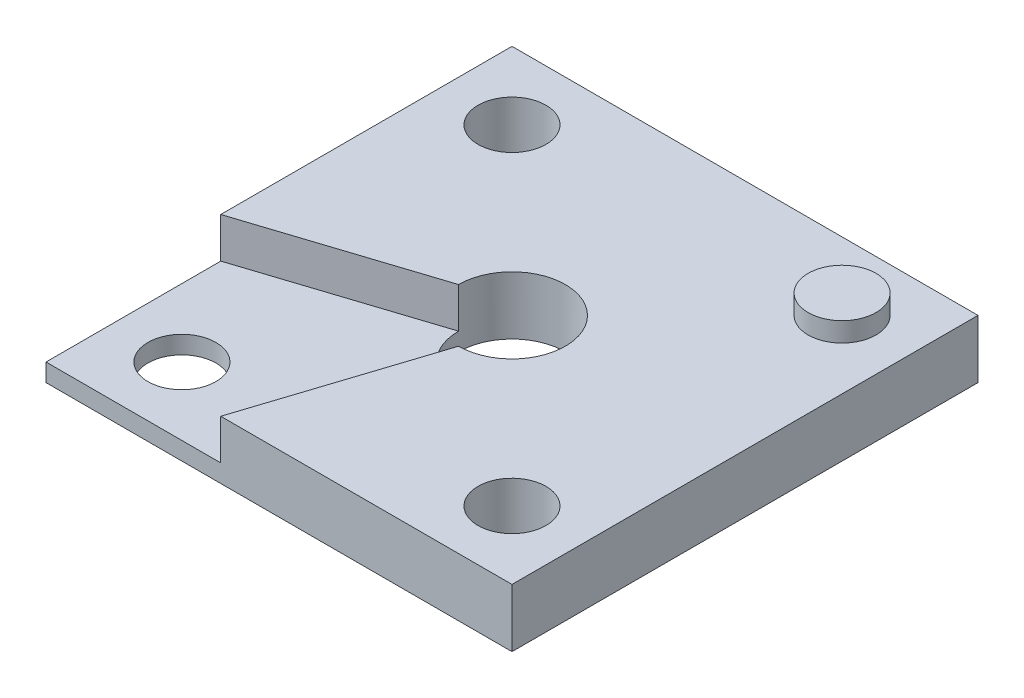
ISO-10303-21;
HEADER;
FILE_DESCRIPTION(('STEP AP214'),'2;1');
FILE_NAME('part.step','',(''),(''),'','','');
FILE_SCHEMA(('AUTOMOTIVE_DESIGN { 1 0 10303 214 1 1 1 1 }'));
ENDSEC;
DATA;
#1=APPLICATION_CONTEXT('core data for automotive mechanical design processes');
#2=APPLICATION_PROTOCOL_DEFINITION('international standard','automotive_design',2000,#1);
#3=PRODUCT_CONTEXT('',#1,'mechanical');
#4=PRODUCT('Part','Part','',(#3));
#5=PRODUCT_RELATED_PRODUCT_CATEGORY('part','',(#4));
#6=PRODUCT_DEFINITION_FORMATION('','',#4);
#7=PRODUCT_DEFINITION_CONTEXT('part definition',#1,'design');
#8=PRODUCT_DEFINITION('design','',#6,#7);
#9=PRODUCT_DEFINITION_SHAPE('','',#8);
#10=(LENGTH_UNIT() NAMED_UNIT(*) SI_UNIT(.MILLI.,.METRE.));
#11=(NAMED_UNIT(*) PLANE_ANGLE_UNIT() SI_UNIT($,.RADIAN.));
#12=(NAMED_UNIT(*) SI_UNIT($,.STERADIAN.) SOLID_ANGLE_UNIT());
#13=UNCERTAINTY_MEASURE_WITH_UNIT(LENGTH_MEASURE(1.E-05),#10,'distance_accuracy_value','');
#14=(GEOMETRIC_REPRESENTATION_CONTEXT(3) GLOBAL_UNCERTAINTY_ASSIGNED_CONTEXT((#13)) GLOBAL_UNIT_ASSIGNED_CONTEXT((#10,
#11,#12)) REPRESENTATION_CONTEXT('',''));
#15=CARTESIAN_POINT('',(0.,0.,0.));
#16=DIRECTION('',(0.,0.,1.));
#17=DIRECTION('',(1.,0.,0.));
#18=AXIS2_PLACEMENT_3D('',#15,#16,#17);
#19=CARTESIAN_POINT('',(-26.9875,9.525,26.9875));
#20=DIRECTION('',(0.,-1.,0.));
#21=DIRECTION('',(0.,0.,-1.));
#22=AXIS2_PLACEMENT_3D('',#19,#20,#21);
#23=CYLINDRICAL_SURFACE('',#22,5.55625);
#24=CARTESIAN_POINT('',(-26.9875,0.,26.9875));
#25=DIRECTION('',(0.,1.,0.));
#26=DIRECTION('',(0.,0.,1.));
#27=AXIS2_PLACEMENT_3D('',#24,#25,#26);
#28=CIRCLE('',#27,5.55625);
#29=CARTESIAN_POINT('',(-26.9875,0.,21.43125));
#30=VERTEX_POINT('',#29);
#31=EDGE_CURVE('E163',#30,#30,#28,.T.);
#32=CARTESIAN_POINT('',(-26.9875,2.921,26.9875));
#33=DIRECTION('',(0.,1.,0.));
#34=DIRECTION('',(0.,0.,1.));
#35=AXIS2_PLACEMENT_3D('',#32,#33,#34);
#36=CIRCLE('',#35,5.55625);
#37=CARTESIAN_POINT('',(-26.9875,2.921,21.43125));
#38=VERTEX_POINT('',#37);
#39=EDGE_CURVE('E171',#38,#38,#36,.T.);
#40=CARTESIAN_POINT('',(-26.9875,0.,21.43125));
#41=CARTESIAN_POINT('',(-26.9875,0.0304270833333334,21.43125));
#42=CARTESIAN_POINT('',(-26.9875,0.0608541666666668,21.43125));
#43=CARTESIAN_POINT('',(-26.9875,0.121708333333334,21.43125));
#44=CARTESIAN_POINT('',(-26.9875,0.152135416666667,21.43125));
#45=CARTESIAN_POINT('',(-26.9875,0.212989583333334,21.43125));
#46=CARTESIAN_POINT('',(-26.9875,0.243416666666667,21.43125));
#47=CARTESIAN_POINT('',(-26.9875,0.304270833333334,21.43125));
#48=CARTESIAN_POINT('',(-26.9875,0.334697916666667,21.43125));
#49=CARTESIAN_POINT('',(-26.9875,0.395552083333334,21.43125));
#50=CARTESIAN_POINT('',(-26.9875,0.425979166666668,21.43125));
#51=CARTESIAN_POINT('',(-26.9875,0.486833333333334,21.43125));
#52=CARTESIAN_POINT('',(-26.9875,0.517260416666667,21.43125));
#53=CARTESIAN_POINT('',(-26.9875,0.578114583333333,21.43125));
#54=CARTESIAN_POINT('',(-26.9875,0.608541666666666,21.43125));
#55=CARTESIAN_POINT('',(-26.9875,0.669395833333333,21.43125));
#56=CARTESIAN_POINT('',(-26.9875,0.699822916666667,21.43125));
#57=CARTESIAN_POINT('',(-26.9875,0.760677083333333,21.43125));
#58=CARTESIAN_POINT('',(-26.9875,0.791104166666667,21.43125));
#59=CARTESIAN_POINT('',(-26.9875,0.851958333333334,21.43125));
#60=CARTESIAN_POINT('',(-26.9875,0.882385416666667,21.43125));
#61=CARTESIAN_POINT('',(-26.9875,0.943239583333334,21.43125));
#62=CARTESIAN_POINT('',(-26.9875,0.973666666666667,21.43125));
#63=CARTESIAN_POINT('',(-26.9875,1.03452083333333,21.43125));
#64=CARTESIAN_POINT('',(-26.9875,1.06494791666667,21.43125));
#65=CARTESIAN_POINT('',(-26.9875,1.12580208333333,21.43125));
#66=CARTESIAN_POINT('',(-26.9875,1.15622916666667,21.43125));
#67=CARTESIAN_POINT('',(-26.9875,1.21708333333333,21.43125));
#68=CARTESIAN_POINT('',(-26.9875,1.24751041666667,21.43125));
#69=CARTESIAN_POINT('',(-26.9875,1.30836458333333,21.43125));
#70=CARTESIAN_POINT('',(-26.9875,1.33879166666667,21.43125));
#71=CARTESIAN_POINT('',(-26.9875,1.39964583333333,21.43125));
#72=CARTESIAN_POINT('',(-26.9875,1.43007291666667,21.43125));
#73=CARTESIAN_POINT('',(-26.9875,1.49092708333333,21.43125));
#74=CARTESIAN_POINT('',(-26.9875,1.52135416666667,21.43125));
#75=CARTESIAN_POINT('',(-26.9875,1.58220833333333,21.43125));
#76=CARTESIAN_POINT('',(-26.9875,1.61263541666667,21.43125));
#77=CARTESIAN_POINT('',(-26.9875,1.67348958333333,21.43125));
#78=CARTESIAN_POINT('',(-26.9875,1.70391666666667,21.43125));
#79=CARTESIAN_POINT('',(-26.9875,1.76477083333333,21.43125));
#80=CARTESIAN_POINT('',(-26.9875,1.79519791666667,21.43125));
#81=CARTESIAN_POINT('',(-26.9875,1.85605208333333,21.43125));
#82=CARTESIAN_POINT('',(-26.9875,1.88647916666667,21.43125));
#83=CARTESIAN_POINT('',(-26.9875,1.94733333333333,21.43125));
#84=CARTESIAN_POINT('',(-26.9875,1.97776041666667,21.43125));
#85=CARTESIAN_POINT('',(-26.9875,2.03861458333333,21.43125));
#86=CARTESIAN_POINT('',(-26.9875,2.06904166666667,21.43125));
#87=CARTESIAN_POINT('',(-26.9875,2.12989583333333,21.43125));
#88=CARTESIAN_POINT('',(-26.9875,2.16032291666667,21.43125));
#89=CARTESIAN_POINT('',(-26.9875,2.22117708333333,21.43125));
#90=CARTESIAN_POINT('',(-26.9875,2.25160416666667,21.43125));
#91=CARTESIAN_POINT('',(-26.9875,2.31245833333333,21.43125));
#92=CARTESIAN_POINT('',(-26.9875,2.34288541666667,21.43125));
#93=CARTESIAN_POINT('',(-26.9875,2.40373958333333,21.43125));
#94=CARTESIAN_POINT('',(-26.9875,2.43416666666667,21.43125));
#95=CARTESIAN_POINT('',(-26.9875,2.49502083333333,21.43125));
#96=CARTESIAN_POINT('',(-26.9875,2.52544791666667,21.43125));
#97=CARTESIAN_POINT('',(-26.9875,2.58630208333333,21.43125));
#98=CARTESIAN_POINT('',(-26.9875,2.61672916666667,21.43125));
#99=CARTESIAN_POINT('',(-26.9875,2.67758333333333,21.43125));
#100=CARTESIAN_POINT('',(-26.9875,2.70801041666667,21.43125));
#101=CARTESIAN_POINT('',(-26.9875,2.76886458333333,21.43125));
#102=CARTESIAN_POINT('',(-26.9875,2.79929166666667,21.43125));
#103=CARTESIAN_POINT('',(-26.9875,2.86014583333333,21.43125));
#104=CARTESIAN_POINT('',(-26.9875,2.89057291666667,21.43125));
#105=CARTESIAN_POINT('',(-26.9875,2.921,21.43125));
#106=B_SPLINE_CURVE_WITH_KNOTS('',3,(#40,#41,#42,#43,#44,#45,#46,#47,#48,#49,#50,#51,#52,#53,
#54,#55,#56,#57,#58,#59,#60,#61,#62,#63,#64,#65,#66,#67,#68,#69,#70,#71,#72,#73,#74,#75,#76,#77,
#78,#79,#80,#81,#82,#83,#84,#85,#86,#87,#88,#89,#90,#91,#92,#93,#94,#95,#96,#97,#98,#99,#100,
#101,#102,#103,#104,#105),.UNSPECIFIED.,.F.,.F.,(4,2,2,2,2,2,2,2,2,2,2,2,2,2,2,2,2,2,2,2,2,2,2,
2,2,2,2,2,2,2,2,2,4),(0.,0.0912812500000002,0.1825625,0.273843750000001,0.365125000000001,
0.456406250000001,0.5476875,0.63896875,0.73025,0.82153125,0.9128125,1.00409375,1.095375,
1.18665625,1.2779375,1.36921875,1.4605,1.55178125,1.6430625,1.73434375,1.825625,1.91690625,
2.0081875,2.09946875,2.19075,2.28203125,2.3733125,2.46459375,2.555875,2.64715625,2.7384375,
2.82971875,2.921),.UNSPECIFIED.);
#107=EDGE_CURVE('BSEAM39',#30,#38,#106,.T.);
#108=ORIENTED_EDGE('',*,*,#31,.F.);
#109=ORIENTED_EDGE('',*,*,#39,.T.);
#110=ORIENTED_EDGE('',*,*,#107,.T.);
#111=ORIENTED_EDGE('',*,*,#107,.F.);
#112=EDGE_LOOP('',(#108,#110,#109,#111));
#113=FACE_BOUND('',#112,.T.);
#114=ADVANCED_FACE('F39',(#113),#23,.F.);
#115=CARTESIAN_POINT('',(38.1,9.525,0.));
#116=DIRECTION('',(1.,0.,0.));
#117=DIRECTION('',(0.,0.,-1.));
#118=AXIS2_PLACEMENT_3D('',#115,#116,#117);
#119=PLANE('',#118);
#120=DIRECTION('',(0.,0.,1.));
#121=VECTOR('',#120,1.);
#122=CARTESIAN_POINT('',(38.1,0.,0.));
#123=LINE('',#122,#121);
#124=CARTESIAN_POINT('',(38.1,0.,-38.1));
#125=VERTEX_POINT('',#124);
#126=CARTESIAN_POINT('',(38.1,0.,38.1));
#127=VERTEX_POINT('',#126);
#128=EDGE_CURVE('E151',#125,#127,#123,.T.);
#129=ORIENTED_EDGE('',*,*,#128,.F.);
#130=DIRECTION('',(0.,-1.,0.));
#131=VECTOR('',#130,1.);
#132=CARTESIAN_POINT('',(38.1,9.525,-38.1));
#133=LINE('',#132,#131);
#134=CARTESIAN_POINT('',(38.1,9.525,-38.1));
#135=VERTEX_POINT('',#134);
#136=EDGE_CURVE('E11',#135,#125,#133,.T.);
#137=ORIENTED_EDGE('',*,*,#136,.F.);
#138=DIRECTION('',(0.,0.,1.));
#139=VECTOR('',#138,1.);
#140=CARTESIAN_POINT('',(38.1,9.525,0.));
#141=LINE('',#140,#139);
#142=CARTESIAN_POINT('',(38.1,9.525,38.1));
#143=VERTEX_POINT('',#142);
#144=EDGE_CURVE('E182',#135,#143,#141,.T.);
#145=ORIENTED_EDGE('',*,*,#144,.T.);
#146=DIRECTION('',(0.,-1.,0.));
#147=VECTOR('',#146,1.);
#148=CARTESIAN_POINT('',(38.1,9.525,38.1));
#149=LINE('',#148,#147);
#150=EDGE_CURVE('E83',#143,#127,#149,.T.);
#151=ORIENTED_EDGE('',*,*,#150,.T.);
#152=EDGE_LOOP('',(#129,#137,#145,#151));
#153=FACE_BOUND('',#152,.T.);
#154=ADVANCED_FACE('F249',(#153),#119,.T.);
#155=CARTESIAN_POINT('',(0.,9.525,-38.1));
#156=DIRECTION('',(0.,0.,-1.));
#157=DIRECTION('',(-1.,0.,0.));
#158=AXIS2_PLACEMENT_3D('',#155,#156,#157);
#159=PLANE('',#158);
#160=DIRECTION('',(1.,0.,0.));
#161=VECTOR('',#160,1.);
#162=CARTESIAN_POINT('',(0.,0.,-38.1));
#163=LINE('',#162,#161);
#164=CARTESIAN_POINT('',(-38.1,0.,-38.1));
#165=VERTEX_POINT('',#164);
#166=EDGE_CURVE('E147',#165,#125,#163,.T.);
#167=ORIENTED_EDGE('',*,*,#166,.F.);
#168=DIRECTION('',(0.,-1.,0.));
#169=VECTOR('',#168,1.);
#170=CARTESIAN_POINT('',(-38.1,9.525,-38.1));
#171=LINE('',#170,#169);
#172=CARTESIAN_POINT('',(-38.1,9.525,-38.1));
#173=VERTEX_POINT('',#172);
#174=EDGE_CURVE('E48',#173,#165,#171,.T.);
#175=ORIENTED_EDGE('',*,*,#174,.F.);
#176=DIRECTION('',(1.,0.,0.));
#177=VECTOR('',#176,1.);
#178=CARTESIAN_POINT('',(0.,9.525,-38.1));
#179=LINE('',#178,#177);
#180=EDGE_CURVE('E178',#173,#135,#179,.T.);
#181=ORIENTED_EDGE('',*,*,#180,.T.);
#182=ORIENTED_EDGE('',*,*,#136,.T.);
#183=EDGE_LOOP('',(#167,#175,#181,#182));
#184=FACE_BOUND('',#183,.T.);
#185=ADVANCED_FACE('F254',(#184),#159,.T.);
#186=CARTESIAN_POINT('',(-38.1,9.525,0.));
#187=DIRECTION('',(1.,0.,0.));
#188=DIRECTION('',(0.,0.,-1.));
#189=AXIS2_PLACEMENT_3D('',#186,#187,#188);
#190=PLANE('',#189);
#191=DIRECTION('',(0.,0.,1.));
#192=VECTOR('',#191,1.);
#193=CARTESIAN_POINT('',(-38.1,2.921,38.1));
#194=LINE('',#193,#192);
#195=CARTESIAN_POINT('',(-38.1,2.921,9.52499999999991));
#196=VERTEX_POINT('',#195);
#197=CARTESIAN_POINT('',(-38.1,2.921,38.1));
#198=VERTEX_POINT('',#197);
#199=EDGE_CURVE('E111',#196,#198,#194,.T.);
#200=ORIENTED_EDGE('',*,*,#199,.F.);
#201=DIRECTION('',(0.,1.,0.));
#202=VECTOR('',#201,1.);
#203=CARTESIAN_POINT('',(-38.1,2.921,9.52499999999991));
#204=LINE('',#203,#202);
#205=CARTESIAN_POINT('',(-38.1,9.525,9.52499999999991));
#206=VERTEX_POINT('',#205);
#207=EDGE_CURVE('E203',#196,#206,#204,.T.);
#208=ORIENTED_EDGE('',*,*,#207,.T.);
#209=DIRECTION('',(0.,0.,1.));
#210=VECTOR('',#209,1.);
#211=CARTESIAN_POINT('',(-38.1,9.525,0.));
#212=LINE('',#211,#210);
#213=EDGE_CURVE('E174',#173,#206,#212,.T.);
#214=ORIENTED_EDGE('',*,*,#213,.F.);
#215=ORIENTED_EDGE('',*,*,#174,.T.);
#216=DIRECTION('',(0.,0.,1.));
#217=VECTOR('',#216,1.);
#218=CARTESIAN_POINT('',(-38.1,0.,0.));
#219=LINE('',#218,#217);
#220=CARTESIAN_POINT('',(-38.1,0.,38.1));
#221=VERTEX_POINT('',#220);
#222=EDGE_CURVE('E134',#165,#221,#219,.T.);
#223=ORIENTED_EDGE('',*,*,#222,.T.);
#224=DIRECTION('',(0.,-1.,0.));
#225=VECTOR('',#224,1.);
#226=CARTESIAN_POINT('',(-38.1,9.525,38.1));
#227=LINE('',#226,#225);
#228=EDGE_CURVE('E126',#198,#221,#227,.T.);
#229=ORIENTED_EDGE('',*,*,#228,.F.);
#230=EDGE_LOOP('',(#200,#208,#214,#215,#223,#229));
#231=FACE_BOUND('',#230,.T.);
#232=ADVANCED_FACE('F132',(#231),#190,.F.);
#233=CARTESIAN_POINT('',(-26.9875,9.525,-26.9875));
#234=DIRECTION('',(0.,-1.,0.));
#235=DIRECTION('',(0.,0.,-1.));
#236=AXIS2_PLACEMENT_3D('',#233,#234,#235);
#237=CYLINDRICAL_SURFACE('',#236,5.55625);
#238=CARTESIAN_POINT('',(-26.9875,9.525,-26.9875));
#239=DIRECTION('',(0.,1.,0.));
#240=DIRECTION('',(0.,0.,1.));
#241=AXIS2_PLACEMENT_3D('',#238,#239,#240);
#242=CIRCLE('',#241,5.55625);
#243=CARTESIAN_POINT('',(-26.9875,9.525,-32.54375));
#244=VERTEX_POINT('',#243);
#245=EDGE_CURVE('E185',#244,#244,#242,.T.);
#246=CARTESIAN_POINT('',(-26.9875,0.,-26.9875));
#247=DIRECTION('',(0.,1.,0.));
#248=DIRECTION('',(0.,0.,1.));
#249=AXIS2_PLACEMENT_3D('',#246,#247,#248);
#250=CIRCLE('',#249,5.55625);
#251=CARTESIAN_POINT('',(-26.9875,0.,-32.54375));
#252=VERTEX_POINT('',#251);
#253=EDGE_CURVE('E155',#252,#252,#250,.T.);
#254=CARTESIAN_POINT('',(-26.9875,9.525,-32.54375));
#255=CARTESIAN_POINT('',(-26.9875,9.42578125,-32.54375));
#256=CARTESIAN_POINT('',(-26.9875,9.3265625,-32.54375));
#257=CARTESIAN_POINT('',(-26.9875,9.128125,-32.54375));
#258=CARTESIAN_POINT('',(-26.9875,9.02890625,-32.54375));
#259=CARTESIAN_POINT('',(-26.9875,8.83046875,-32.54375));
#260=CARTESIAN_POINT('',(-26.9875,8.73125,-32.54375));
#261=CARTESIAN_POINT('',(-26.9875,8.5328125,-32.54375));
#262=CARTESIAN_POINT('',(-26.9875,8.43359375,-32.54375));
#263=CARTESIAN_POINT('',(-26.9875,8.23515625,-32.54375));
#264=CARTESIAN_POINT('',(-26.9875,8.1359375,-32.54375));
#265=CARTESIAN_POINT('',(-26.9875,7.9375,-32.54375));
#266=CARTESIAN_POINT('',(-26.9875,7.83828125,-32.54375));
#267=CARTESIAN_POINT('',(-26.9875,7.63984375,-32.54375));
#268=CARTESIAN_POINT('',(-26.9875,7.540625,-32.54375));
#269=CARTESIAN_POINT('',(-26.9875,7.3421875,-32.54375));
#270=CARTESIAN_POINT('',(-26.9875,7.24296875,-32.54375));
#271=CARTESIAN_POINT('',(-26.9875,7.04453125,-32.54375));
#272=CARTESIAN_POINT('',(-26.9875,6.9453125,-32.54375));
#273=CARTESIAN_POINT('',(-26.9875,6.746875,-32.54375));
#274=CARTESIAN_POINT('',(-26.9875,6.64765625,-32.54375));
#275=CARTESIAN_POINT('',(-26.9875,6.44921875,-32.54375));
#276=CARTESIAN_POINT('',(-26.9875,6.35,-32.54375));
#277=CARTESIAN_POINT('',(-26.9875,6.1515625,-32.54375));
#278=CARTESIAN_POINT('',(-26.9875,6.05234375,-32.54375));
#279=CARTESIAN_POINT('',(-26.9875,5.85390625,-32.54375));
#280=CARTESIAN_POINT('',(-26.9875,5.7546875,-32.54375));
#281=CARTESIAN_POINT('',(-26.9875,5.55625,-32.54375));
#282=CARTESIAN_POINT('',(-26.9875,5.45703125,-32.54375));
#283=CARTESIAN_POINT('',(-26.9875,5.25859375,-32.54375));
#284=CARTESIAN_POINT('',(-26.9875,5.159375,-32.54375));
#285=CARTESIAN_POINT('',(-26.9875,4.9609375,-32.54375));
#286=CARTESIAN_POINT('',(-26.9875,4.86171875,-32.54375));
#287=CARTESIAN_POINT('',(-26.9875,4.66328125,-32.54375));
#288=CARTESIAN_POINT('',(-26.9875,4.5640625,-32.54375));
#289=CARTESIAN_POINT('',(-26.9875,4.365625,-32.54375));
#290=CARTESIAN_POINT('',(-26.9875,4.26640625,-32.54375));
#291=CARTESIAN_POINT('',(-26.9875,4.06796875,-32.54375));
#292=CARTESIAN_POINT('',(-26.9875,3.96875,-32.54375));
#293=CARTESIAN_POINT('',(-26.9875,3.7703125,-32.54375));
#294=CARTESIAN_POINT('',(-26.9875,3.67109375,-32.54375));
#295=CARTESIAN_POINT('',(-26.9875,3.47265625,-32.54375));
#296=CARTESIAN_POINT('',(-26.9875,3.3734375,-32.54375));
#297=CARTESIAN_POINT('',(-26.9875,3.175,-32.54375));
#298=CARTESIAN_POINT('',(-26.9875,3.07578125,-32.54375));
#299=CARTESIAN_POINT('',(-26.9875,2.87734375,-32.54375));
#300=CARTESIAN_POINT('',(-26.9875,2.778125,-32.54375));
#301=CARTESIAN_POINT('',(-26.9875,2.5796875,-32.54375));
#302=CARTESIAN_POINT('',(-26.9875,2.48046875,-32.54375));
#303=CARTESIAN_POINT('',(-26.9875,2.28203125,-32.54375));
#304=CARTESIAN_POINT('',(-26.9875,2.1828125,-32.54375));
#305=CARTESIAN_POINT('',(-26.9875,1.984375,-32.54375));
#306=CARTESIAN_POINT('',(-26.9875,1.88515625,-32.54375));
#307=CARTESIAN_POINT('',(-26.9875,1.68671875,-32.54375));
#308=CARTESIAN_POINT('',(-26.9875,1.5875,-32.54375));
#309=CARTESIAN_POINT('',(-26.9875,1.3890625,-32.54375));
#310=CARTESIAN_POINT('',(-26.9875,1.28984375,-32.54375));
#311=CARTESIAN_POINT('',(-26.9875,1.09140625,-32.54375));
#312=CARTESIAN_POINT('',(-26.9875,0.992187500000001,-32.54375));
#313=CARTESIAN_POINT('',(-26.9875,0.793750000000001,-32.54375));
#314=CARTESIAN_POINT('',(-26.9875,0.69453125,-32.54375));
#315=CARTESIAN_POINT('',(-26.9875,0.49609375,-32.54375));
#316=CARTESIAN_POINT('',(-26.9875,0.396875,-32.54375));
#317=CARTESIAN_POINT('',(-26.9875,0.1984375,-32.54375));
#318=CARTESIAN_POINT('',(-26.9875,0.0992187500000001,-32.54375));
#319=CARTESIAN_POINT('',(-26.9875,0.,-32.54375));
#320=B_SPLINE_CURVE_WITH_KNOTS('',3,(#254,#255,#256,#257,#258,#259,#260,#261,#262,#263,#264,
#265,#266,#267,#268,#269,#270,#271,#272,#273,#274,#275,#276,#277,#278,#279,#280,#281,#282,#283,
#284,#285,#286,#287,#288,#289,#290,#291,#292,#293,#294,#295,#296,#297,#298,#299,#300,#301,#302,
#303,#304,#305,#306,#307,#308,#309,#310,#311,#312,#313,#314,#315,#316,#317,#318,#319),
.UNSPECIFIED.,.F.,.F.,(4,2,2,2,2,2,2,2,2,2,2,2,2,2,2,2,2,2,2,2,2,2,2,2,2,2,2,2,2,2,2,2,4),(0.,
0.29765625,0.5953125,0.892968750000001,1.190625,1.48828125,1.7859375,2.08359375,2.38125,
2.67890625,2.9765625,3.27421875,3.571875,3.86953125,4.1671875,4.46484375,4.7625,5.06015625,
5.3578125,5.65546875,5.953125,6.25078125,6.5484375,6.84609375,7.14375,7.44140625,7.7390625,
8.03671875,8.334375,8.63203125,8.9296875,9.22734375,9.525),.UNSPECIFIED.);
#321=EDGE_CURVE('BSEAM262',#244,#252,#320,.T.);
#322=ORIENTED_EDGE('',*,*,#245,.T.);
#323=ORIENTED_EDGE('',*,*,#253,.F.);
#324=ORIENTED_EDGE('',*,*,#321,.T.);
#325=ORIENTED_EDGE('',*,*,#321,.F.);
#326=EDGE_LOOP('',(#322,#324,#323,#325));
#327=FACE_BOUND('',#326,.T.);
#328=ADVANCED_FACE('F262',(#327),#237,.F.);
#329=CARTESIAN_POINT('',(26.9875,9.525,26.9875));
#330=DIRECTION('',(0.,-1.,0.));
#331=DIRECTION('',(0.,0.,-1.));
#332=AXIS2_PLACEMENT_3D('',#329,#330,#331);
#333=CYLINDRICAL_SURFACE('',#332,5.55625);
#334=CARTESIAN_POINT('',(26.9875,9.525,26.9875));
#335=DIRECTION('',(0.,1.,0.));
#336=DIRECTION('',(0.,0.,1.));
#337=AXIS2_PLACEMENT_3D('',#334,#335,#336);
#338=CIRCLE('',#337,5.55625);
#339=CARTESIAN_POINT('',(26.9875,9.525,21.43125));
#340=VERTEX_POINT('',#339);
#341=EDGE_CURVE('E189',#340,#340,#338,.T.);
#342=CARTESIAN_POINT('',(26.9875,0.,26.9875));
#343=DIRECTION('',(0.,1.,0.));
#344=DIRECTION('',(0.,0.,1.));
#345=AXIS2_PLACEMENT_3D('',#342,#343,#344);
#346=CIRCLE('',#345,5.55625);
#347=CARTESIAN_POINT('',(26.9875,0.,21.43125));
#348=VERTEX_POINT('',#347);
#349=EDGE_CURVE('E159',#348,#348,#346,.T.);
#350=CARTESIAN_POINT('',(26.9875,9.525,21.43125));
#351=CARTESIAN_POINT('',(26.9875,9.42578125,21.43125));
#352=CARTESIAN_POINT('',(26.9875,9.3265625,21.43125));
#353=CARTESIAN_POINT('',(26.9875,9.128125,21.43125));
#354=CARTESIAN_POINT('',(26.9875,9.02890625,21.43125));
#355=CARTESIAN_POINT('',(26.9875,8.83046875,21.43125));
#356=CARTESIAN_POINT('',(26.9875,8.73125,21.43125));
#357=CARTESIAN_POINT('',(26.9875,8.5328125,21.43125));
#358=CARTESIAN_POINT('',(26.9875,8.43359375,21.43125));
#359=CARTESIAN_POINT('',(26.9875,8.23515625,21.43125));
#360=CARTESIAN_POINT('',(26.9875,8.1359375,21.43125));
#361=CARTESIAN_POINT('',(26.9875,7.9375,21.43125));
#362=CARTESIAN_POINT('',(26.9875,7.83828125,21.43125));
#363=CARTESIAN_POINT('',(26.9875,7.63984375,21.43125));
#364=CARTESIAN_POINT('',(26.9875,7.540625,21.43125));
#365=CARTESIAN_POINT('',(26.9875,7.3421875,21.43125));
#366=CARTESIAN_POINT('',(26.9875,7.24296875,21.43125));
#367=CARTESIAN_POINT('',(26.9875,7.04453125,21.43125));
#368=CARTESIAN_POINT('',(26.9875,6.9453125,21.43125));
#369=CARTESIAN_POINT('',(26.9875,6.746875,21.43125));
#370=CARTESIAN_POINT('',(26.9875,6.64765625,21.43125));
#371=CARTESIAN_POINT('',(26.9875,6.44921875,21.43125));
#372=CARTESIAN_POINT('',(26.9875,6.35,21.43125));
#373=CARTESIAN_POINT('',(26.9875,6.1515625,21.43125));
#374=CARTESIAN_POINT('',(26.9875,6.05234375,21.43125));
#375=CARTESIAN_POINT('',(26.9875,5.85390625,21.43125));
#376=CARTESIAN_POINT('',(26.9875,5.7546875,21.43125));
#377=CARTESIAN_POINT('',(26.9875,5.55625,21.43125));
#378=CARTESIAN_POINT('',(26.9875,5.45703125,21.43125));
#379=CARTESIAN_POINT('',(26.9875,5.25859375,21.43125));
#380=CARTESIAN_POINT('',(26.9875,5.159375,21.43125));
#381=CARTESIAN_POINT('',(26.9875,4.9609375,21.43125));
#382=CARTESIAN_POINT('',(26.9875,4.86171875,21.43125));
#383=CARTESIAN_POINT('',(26.9875,4.66328125,21.43125));
#384=CARTESIAN_POINT('',(26.9875,4.5640625,21.43125));
#385=CARTESIAN_POINT('',(26.9875,4.365625,21.43125));
#386=CARTESIAN_POINT('',(26.9875,4.26640625,21.43125));
#387=CARTESIAN_POINT('',(26.9875,4.06796875,21.43125));
#388=CARTESIAN_POINT('',(26.9875,3.96875,21.43125));
#389=CARTESIAN_POINT('',(26.9875,3.7703125,21.43125));
#390=CARTESIAN_POINT('',(26.9875,3.67109375,21.43125));
#391=CARTESIAN_POINT('',(26.9875,3.47265625,21.43125));
#392=CARTESIAN_POINT('',(26.9875,3.3734375,21.43125));
#393=CARTESIAN_POINT('',(26.9875,3.175,21.43125));
#394=CARTESIAN_POINT('',(26.9875,3.07578125,21.43125));
#395=CARTESIAN_POINT('',(26.9875,2.87734375,21.43125));
#396=CARTESIAN_POINT('',(26.9875,2.778125,21.43125));
#397=CARTESIAN_POINT('',(26.9875,2.5796875,21.43125));
#398=CARTESIAN_POINT('',(26.9875,2.48046875,21.43125));
#399=CARTESIAN_POINT('',(26.9875,2.28203125,21.43125));
#400=CARTESIAN_POINT('',(26.9875,2.1828125,21.43125));
#401=CARTESIAN_POINT('',(26.9875,1.984375,21.43125));
#402=CARTESIAN_POINT('',(26.9875,1.88515625,21.43125));
#403=CARTESIAN_POINT('',(26.9875,1.68671875,21.43125));
#404=CARTESIAN_POINT('',(26.9875,1.5875,21.43125));
#405=CARTESIAN_POINT('',(26.9875,1.3890625,21.43125));
#406=CARTESIAN_POINT('',(26.9875,1.28984375,21.43125));
#407=CARTESIAN_POINT('',(26.9875,1.09140625,21.43125));
#408=CARTESIAN_POINT('',(26.9875,0.992187500000001,21.43125));
#409=CARTESIAN_POINT('',(26.9875,0.793750000000001,21.43125));
#410=CARTESIAN_POINT('',(26.9875,0.69453125,21.43125));
#411=CARTESIAN_POINT('',(26.9875,0.49609375,21.43125));
#412=CARTESIAN_POINT('',(26.9875,0.396875,21.43125));
#413=CARTESIAN_POINT('',(26.9875,0.1984375,21.43125));
#414=CARTESIAN_POINT('',(26.9875,0.0992187500000001,21.43125));
#415=CARTESIAN_POINT('',(26.9875,0.,21.43125));
#416=B_SPLINE_CURVE_WITH_KNOTS('',3,(#350,#351,#352,#353,#354,#355,#356,#357,#358,#359,#360,
#361,#362,#363,#364,#365,#366,#367,#368,#369,#370,#371,#372,#373,#374,#375,#376,#377,#378,#379,
#380,#381,#382,#383,#384,#385,#386,#387,#388,#389,#390,#391,#392,#393,#394,#395,#396,#397,#398,
#399,#400,#401,#402,#403,#404,#405,#406,#407,#408,#409,#410,#411,#412,#413,#414,#415),
.UNSPECIFIED.,.F.,.F.,(4,2,2,2,2,2,2,2,2,2,2,2,2,2,2,2,2,2,2,2,2,2,2,2,2,2,2,2,2,2,2,2,4),(0.,
0.29765625,0.5953125,0.892968750000001,1.190625,1.48828125,1.7859375,2.08359375,2.38125,
2.67890625,2.9765625,3.27421875,3.571875,3.86953125,4.1671875,4.46484375,4.7625,5.06015625,
5.3578125,5.65546875,5.953125,6.25078125,6.5484375,6.84609375,7.14375,7.44140625,7.7390625,
8.03671875,8.334375,8.63203125,8.9296875,9.22734375,9.525),.UNSPECIFIED.);
#417=EDGE_CURVE('BSEAM259',#340,#348,#416,.T.);
#418=ORIENTED_EDGE('',*,*,#341,.T.);
#419=ORIENTED_EDGE('',*,*,#349,.F.);
#420=ORIENTED_EDGE('',*,*,#417,.T.);
#421=ORIENTED_EDGE('',*,*,#417,.F.);
#422=EDGE_LOOP('',(#418,#420,#419,#421));
#423=FACE_BOUND('',#422,.T.);
#424=ADVANCED_FACE('F259',(#423),#333,.F.);
#425=CARTESIAN_POINT('',(0.,9.525,0.));
#426=DIRECTION('',(0.,-1.,0.));
#427=DIRECTION('',(0.,0.,-1.));
#428=AXIS2_PLACEMENT_3D('',#425,#426,#427);
#429=CYLINDRICAL_SURFACE('',#428,8.73125);
#430=DIRECTION('',(0.,1.,0.));
#431=VECTOR('',#430,1.);
#432=CARTESIAN_POINT('',(-8.73125000000001,2.921,0.));
#433=LINE('',#432,#431);
#434=CARTESIAN_POINT('',(-8.73125000000001,2.921,0.));
#435=VERTEX_POINT('',#434);
#436=CARTESIAN_POINT('',(-8.73125000000001,9.525,0.));
#437=VERTEX_POINT('',#436);
#438=EDGE_CURVE('E210',#435,#437,#433,.T.);
#439=ORIENTED_EDGE('',*,*,#438,.F.);
#440=CARTESIAN_POINT('',(0.,2.921,0.));
#441=DIRECTION('',(0.,1.,0.));
#442=DIRECTION('',(0.,0.,1.));
#443=AXIS2_PLACEMENT_3D('',#440,#441,#442);
#444=CIRCLE('',#443,8.73125);
#445=CARTESIAN_POINT('',(0.,2.921,8.73124999999999));
#446=VERTEX_POINT('',#445);
#447=EDGE_CURVE('E199',#435,#446,#444,.T.);
#448=ORIENTED_EDGE('',*,*,#447,.T.);
#449=DIRECTION('',(0.,1.,0.));
#450=VECTOR('',#449,1.);
#451=CARTESIAN_POINT('',(0.,2.921,8.73124999999999));
#452=LINE('',#451,#450);
#453=CARTESIAN_POINT('',(0.,9.525,8.73124999999999));
#454=VERTEX_POINT('',#453);
#455=EDGE_CURVE('E206',#446,#454,#452,.T.);
#456=ORIENTED_EDGE('',*,*,#455,.T.);
#457=CARTESIAN_POINT('',(0.,9.525,0.));
#458=DIRECTION('',(0.,1.,0.));
#459=DIRECTION('',(0.,0.,1.));
#460=AXIS2_PLACEMENT_3D('',#457,#458,#459);
#461=CIRCLE('',#460,8.73125);
#462=EDGE_CURVE('E144',#454,#437,#461,.T.);
#463=ORIENTED_EDGE('',*,*,#462,.T.);
#464=EDGE_LOOP('',(#439,#448,#456,#463));
#465=FACE_BOUND('',#464,.T.);
#466=CARTESIAN_POINT('',(0.,0.,0.));
#467=DIRECTION('',(0.,1.,0.));
#468=DIRECTION('',(0.,0.,1.));
#469=AXIS2_PLACEMENT_3D('',#466,#467,#468);
#470=CIRCLE('',#469,8.73125);
#471=CARTESIAN_POINT('',(0.,0.,8.73125));
#472=VERTEX_POINT('',#471);
#473=EDGE_CURVE('E167',#472,#472,#470,.T.);
#474=ORIENTED_EDGE('',*,*,#473,.F.);
#475=EDGE_LOOP('',(#474));
#476=FACE_BOUND('',#475,.T.);
#477=ADVANCED_FACE('F41',(#465,#476),#429,.F.);
#478=CARTESIAN_POINT('',(0.,9.525,38.1));
#479=DIRECTION('',(0.,0.,-1.));
#480=DIRECTION('',(-1.,0.,0.));
#481=AXIS2_PLACEMENT_3D('',#478,#479,#480);
#482=PLANE('',#481);
#483=DIRECTION('',(1.,0.,0.));
#484=VECTOR('',#483,1.);
#485=CARTESIAN_POINT('',(0.,9.525,38.1));
#486=LINE('',#485,#484);
#487=CARTESIAN_POINT('',(-9.52500000000001,9.525,38.1));
#488=VERTEX_POINT('',#487);
#489=EDGE_CURVE('E63',#488,#143,#486,.T.);
#490=ORIENTED_EDGE('',*,*,#489,.F.);
#491=DIRECTION('',(0.,1.,0.));
#492=VECTOR('',#491,1.);
#493=CARTESIAN_POINT('',(-9.52500000000001,2.921,38.1));
#494=LINE('',#493,#492);
#495=CARTESIAN_POINT('',(-9.52500000000001,2.921,38.1));
#496=VERTEX_POINT('',#495);
#497=EDGE_CURVE('E55',#496,#488,#494,.T.);
#498=ORIENTED_EDGE('',*,*,#497,.F.);
#499=DIRECTION('',(1.,0.,0.));
#500=VECTOR('',#499,1.);
#501=CARTESIAN_POINT('',(-9.52500000000001,2.921,38.1));
#502=LINE('',#501,#500);
#503=EDGE_CURVE('E115',#198,#496,#502,.T.);
#504=ORIENTED_EDGE('',*,*,#503,.F.);
#505=ORIENTED_EDGE('',*,*,#228,.T.);
#506=DIRECTION('',(1.,0.,0.));
#507=VECTOR('',#506,1.);
#508=CARTESIAN_POINT('',(0.,0.,38.1));
#509=LINE('',#508,#507);
#510=EDGE_CURVE('E141',#221,#127,#509,.T.);
#511=ORIENTED_EDGE('',*,*,#510,.T.);
#512=ORIENTED_EDGE('',*,*,#150,.F.);
#513=EDGE_LOOP('',(#490,#498,#504,#505,#511,#512));
#514=FACE_BOUND('',#513,.T.);
#515=ADVANCED_FACE('F125',(#514),#482,.F.);
#516=CARTESIAN_POINT('',(0.,9.525,0.));
#517=DIRECTION('',(0.,1.,0.));
#518=DIRECTION('',(0.,0.,1.));
#519=AXIS2_PLACEMENT_3D('',#516,#517,#518);
#520=PLANE('',#519);
#521=CARTESIAN_POINT('',(26.9875,9.525,-26.9875));
#522=DIRECTION('',(0.,1.,0.));
#523=DIRECTION('',(0.,0.,1.));
#524=AXIS2_PLACEMENT_3D('',#521,#522,#523);
#525=CIRCLE('',#524,5.55625);
#526=CARTESIAN_POINT('',(26.9875,9.525,-21.43125));
#527=VERTEX_POINT('',#526);
#528=EDGE_CURVE('E220',#527,#527,#525,.F.);
#529=ORIENTED_EDGE('',*,*,#528,.T.);
#530=EDGE_LOOP('',(#529));
#531=FACE_BOUND('',#530,.T.);
#532=DIRECTION('',(-0.951222818948763,0.,0.308504698037434));
#533=VECTOR('',#532,1.);
#534=CARTESIAN_POINT('',(-38.1,9.525,9.52499999999991));
#535=LINE('',#534,#533);
#536=EDGE_CURVE('E122',#437,#206,#535,.T.);
#537=ORIENTED_EDGE('',*,*,#536,.F.);
#538=ORIENTED_EDGE('',*,*,#462,.F.);
#539=DIRECTION('',(0.308504698037436,0.,-0.951222818948763));
#540=VECTOR('',#539,1.);
#541=CARTESIAN_POINT('',(0.,9.525,8.73124999999999));
#542=LINE('',#541,#540);
#543=EDGE_CURVE('E217',#488,#454,#542,.T.);
#544=ORIENTED_EDGE('',*,*,#543,.F.);
#545=ORIENTED_EDGE('',*,*,#489,.T.);
#546=ORIENTED_EDGE('',*,*,#144,.F.);
#547=ORIENTED_EDGE('',*,*,#180,.F.);
#548=ORIENTED_EDGE('',*,*,#213,.T.);
#549=EDGE_LOOP('',(#537,#538,#544,#545,#546,#547,#548));
#550=FACE_BOUND('',#549,.T.);
#551=ORIENTED_EDGE('',*,*,#341,.F.);
#552=EDGE_LOOP('',(#551));
#553=FACE_BOUND('',#552,.T.);
#554=ORIENTED_EDGE('',*,*,#245,.F.);
#555=EDGE_LOOP('',(#554));
#556=FACE_BOUND('',#555,.T.);
#557=ADVANCED_FACE('F274',(#531,#550,#553,#556),#520,.T.);
#558=CARTESIAN_POINT('',(0.,0.,0.));
#559=DIRECTION('',(0.,1.,0.));
#560=DIRECTION('',(0.,0.,1.));
#561=AXIS2_PLACEMENT_3D('',#558,#559,#560);
#562=PLANE('',#561);
#563=ORIENTED_EDGE('',*,*,#473,.T.);
#564=EDGE_LOOP('',(#563));
#565=FACE_BOUND('',#564,.T.);
#566=ORIENTED_EDGE('',*,*,#31,.T.);
#567=EDGE_LOOP('',(#566));
#568=FACE_BOUND('',#567,.T.);
#569=ORIENTED_EDGE('',*,*,#349,.T.);
#570=EDGE_LOOP('',(#569));
#571=FACE_BOUND('',#570,.T.);
#572=ORIENTED_EDGE('',*,*,#253,.T.);
#573=EDGE_LOOP('',(#572));
#574=FACE_BOUND('',#573,.T.);
#575=ORIENTED_EDGE('',*,*,#128,.T.);
#576=ORIENTED_EDGE('',*,*,#510,.F.);
#577=ORIENTED_EDGE('',*,*,#222,.F.);
#578=ORIENTED_EDGE('',*,*,#166,.T.);
#579=EDGE_LOOP('',(#575,#576,#577,#578));
#580=FACE_BOUND('',#579,.T.);
#581=ADVANCED_FACE('F275',(#565,#568,#571,#574,#580),#562,.F.);
#582=CARTESIAN_POINT('',(-38.1,2.921,9.52499999999991));
#583=DIRECTION('',(-0.308504698037434,0.,-0.951222818948763));
#584=DIRECTION('',(-0.951222818948763,0.,0.308504698037434));
#585=AXIS2_PLACEMENT_3D('',#582,#583,#584);
#586=PLANE('',#585);
#587=ORIENTED_EDGE('',*,*,#536,.T.);
#588=ORIENTED_EDGE('',*,*,#207,.F.);
#589=DIRECTION('',(-0.951222818948763,0.,0.308504698037434));
#590=VECTOR('',#589,1.);
#591=CARTESIAN_POINT('',(-38.1,2.921,9.52499999999991));
#592=LINE('',#591,#590);
#593=EDGE_CURVE('E117',#435,#196,#592,.T.);
#594=ORIENTED_EDGE('',*,*,#593,.F.);
#595=ORIENTED_EDGE('',*,*,#438,.T.);
#596=EDGE_LOOP('',(#587,#588,#594,#595));
#597=FACE_BOUND('',#596,.T.);
#598=ADVANCED_FACE('F278',(#597),#586,.F.);
#599=CARTESIAN_POINT('',(0.,2.921,8.73124999999999));
#600=DIRECTION('',(0.951222818948763,0.,0.308504698037436));
#601=DIRECTION('',(0.308504698037436,0.,-0.951222818948763));
#602=AXIS2_PLACEMENT_3D('',#599,#600,#601);
#603=PLANE('',#602);
#604=ORIENTED_EDGE('',*,*,#543,.T.);
#605=ORIENTED_EDGE('',*,*,#455,.F.);
#606=DIRECTION('',(0.308504698037436,0.,-0.951222818948763));
#607=VECTOR('',#606,1.);
#608=CARTESIAN_POINT('',(0.,2.921,8.73124999999999));
#609=LINE('',#608,#607);
#610=EDGE_CURVE('E129',#496,#446,#609,.T.);
#611=ORIENTED_EDGE('',*,*,#610,.F.);
#612=ORIENTED_EDGE('',*,*,#497,.T.);
#613=EDGE_LOOP('',(#604,#605,#611,#612));
#614=FACE_BOUND('',#613,.T.);
#615=ADVANCED_FACE('F244',(#614),#603,.F.);
#616=CARTESIAN_POINT('',(0.,2.921,0.));
#617=DIRECTION('',(0.,1.,0.));
#618=DIRECTION('',(0.,0.,1.));
#619=AXIS2_PLACEMENT_3D('',#616,#617,#618);
#620=PLANE('',#619);
#621=ORIENTED_EDGE('',*,*,#39,.F.);
#622=EDGE_LOOP('',(#621));
#623=FACE_BOUND('',#622,.T.);
#624=ORIENTED_EDGE('',*,*,#593,.T.);
#625=ORIENTED_EDGE('',*,*,#199,.T.);
#626=ORIENTED_EDGE('',*,*,#503,.T.);
#627=ORIENTED_EDGE('',*,*,#610,.T.);
#628=ORIENTED_EDGE('',*,*,#447,.F.);
#629=EDGE_LOOP('',(#624,#625,#626,#627,#628));
#630=FACE_BOUND('',#629,.T.);
#631=ADVANCED_FACE('F113',(#623,#630),#620,.T.);
#632=CARTESIAN_POINT('',(26.9875,12.7,-26.9875));
#633=DIRECTION('',(0.,-1.,0.));
#634=DIRECTION('',(0.,0.,-1.));
#635=AXIS2_PLACEMENT_3D('',#632,#633,#634);
#636=CYLINDRICAL_SURFACE('',#635,5.55625);
#637=ORIENTED_EDGE('',*,*,#528,.F.);
#638=EDGE_LOOP('',(#637));
#639=FACE_BOUND('',#638,.T.);
#640=CARTESIAN_POINT('',(26.9875,12.7,-26.9875));
#641=DIRECTION('',(0.,1.,0.));
#642=DIRECTION('',(0.,0.,1.));
#643=AXIS2_PLACEMENT_3D('',#640,#641,#642);
#644=CIRCLE('',#643,5.55625);
#645=CARTESIAN_POINT('',(26.9875,12.7,-21.43125));
#646=VERTEX_POINT('',#645);
#647=EDGE_CURVE('E228',#646,#646,#644,.T.);
#648=ORIENTED_EDGE('',*,*,#647,.F.);
#649=EDGE_LOOP('',(#648));
#650=FACE_BOUND('',#649,.T.);
#651=ADVANCED_FACE('F235',(#639,#650),#636,.T.);
#652=CARTESIAN_POINT('',(0.,12.7,0.));
#653=DIRECTION('',(0.,1.,0.));
#654=DIRECTION('',(0.,0.,1.));
#655=AXIS2_PLACEMENT_3D('',#652,#653,#654);
#656=PLANE('',#655);
#657=ORIENTED_EDGE('',*,*,#647,.T.);
#658=EDGE_LOOP('',(#657));
#659=FACE_BOUND('',#658,.T.);
#660=ADVANCED_FACE('F233',(#659),#656,.T.);
#661=CLOSED_SHELL('',(#114,#154,#185,#232,#328,#424,#477,#515,#557,#581,#598,#615,#631,#651,#660));
#662=MANIFOLD_SOLID_BREP('B2',#661);
#663=ADVANCED_BREP_SHAPE_REPRESENTATION('',(#18,#662),#14);
#664=SHAPE_DEFINITION_REPRESENTATION(#9,#663);
ENDSEC;
END-ISO-10303-21;
